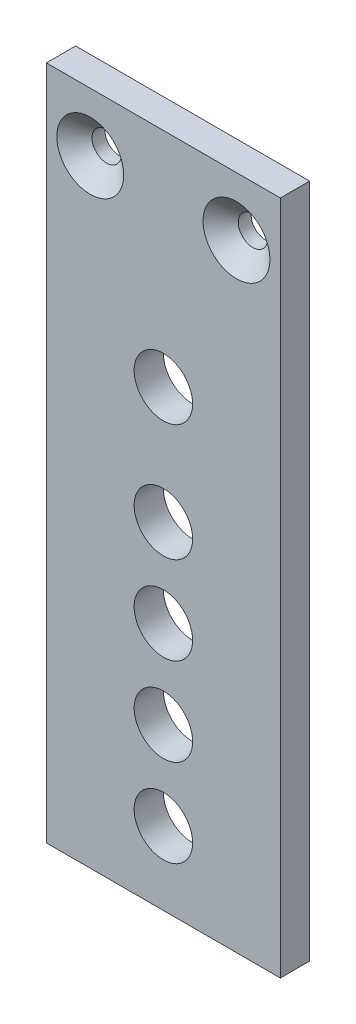
ISO-10303-21;
HEADER;
FILE_DESCRIPTION(('STEP AP214'),'2;1');
FILE_NAME('part.step','',(''),(''),'','','');
FILE_SCHEMA(('AUTOMOTIVE_DESIGN { 1 0 10303 214 1 1 1 1 }'));
ENDSEC;
DATA;
#1=APPLICATION_CONTEXT('core data for automotive mechanical design processes');
#2=APPLICATION_PROTOCOL_DEFINITION('international standard','automotive_design',2000,#1);
#3=PRODUCT_CONTEXT('',#1,'mechanical');
#4=PRODUCT('Part','Part','',(#3));
#5=PRODUCT_RELATED_PRODUCT_CATEGORY('part','',(#4));
#6=PRODUCT_DEFINITION_FORMATION('','',#4);
#7=PRODUCT_DEFINITION_CONTEXT('part definition',#1,'design');
#8=PRODUCT_DEFINITION('design','',#6,#7);
#9=PRODUCT_DEFINITION_SHAPE('','',#8);
#10=(LENGTH_UNIT() NAMED_UNIT(*) SI_UNIT(.MILLI.,.METRE.));
#11=(NAMED_UNIT(*) PLANE_ANGLE_UNIT() SI_UNIT($,.RADIAN.));
#12=(NAMED_UNIT(*) SI_UNIT($,.STERADIAN.) SOLID_ANGLE_UNIT());
#13=UNCERTAINTY_MEASURE_WITH_UNIT(LENGTH_MEASURE(1.E-05),#10,'distance_accuracy_value','');
#14=(GEOMETRIC_REPRESENTATION_CONTEXT(3) GLOBAL_UNCERTAINTY_ASSIGNED_CONTEXT((#13)) GLOBAL_UNIT_ASSIGNED_CONTEXT((#10,
#11,#12)) REPRESENTATION_CONTEXT('',''));
#15=CARTESIAN_POINT('',(0.,0.,0.));
#16=DIRECTION('',(0.,0.,1.));
#17=DIRECTION('',(1.,0.,0.));
#18=AXIS2_PLACEMENT_3D('',#15,#16,#17);
#19=CARTESIAN_POINT('',(0.,0.,6.35));
#20=DIRECTION('',(0.,0.,1.));
#21=DIRECTION('',(1.,0.,0.));
#22=AXIS2_PLACEMENT_3D('',#19,#20,#21);
#23=PLANE('',#22);
#24=CARTESIAN_POINT('',(15.875,-12.7,6.35));
#25=DIRECTION('',(0.,0.,1.));
#26=DIRECTION('',(1.,0.,0.));
#27=AXIS2_PLACEMENT_3D('',#24,#25,#26);
#28=CIRCLE('',#27,7.2644);
#29=CARTESIAN_POINT('',(23.1394,-12.7,6.35));
#30=VERTEX_POINT('',#29);
#31=EDGE_CURVE('E11',#30,#30,#28,.F.);
#32=ORIENTED_EDGE('',*,*,#31,.T.);
#33=EDGE_LOOP('',(#32));
#34=FACE_BOUND('',#33,.T.);
#35=CARTESIAN_POINT('',(-15.875,-12.7,6.35));
#36=DIRECTION('',(0.,0.,1.));
#37=DIRECTION('',(1.,0.,0.));
#38=AXIS2_PLACEMENT_3D('',#35,#36,#37);
#39=CIRCLE('',#38,7.2644);
#40=CARTESIAN_POINT('',(-8.6106,-12.7,6.35));
#41=VERTEX_POINT('',#40);
#42=EDGE_CURVE('E122',#41,#41,#39,.F.);
#43=ORIENTED_EDGE('',*,*,#42,.T.);
#44=EDGE_LOOP('',(#43));
#45=FACE_BOUND('',#44,.T.);
#46=CARTESIAN_POINT('',(0.,-73.66,6.35));
#47=DIRECTION('',(0.,0.,1.));
#48=DIRECTION('',(1.,0.,0.));
#49=AXIS2_PLACEMENT_3D('',#46,#47,#48);
#50=CIRCLE('',#49,6.34999999999999);
#51=CARTESIAN_POINT('',(6.35,-73.66,6.35));
#52=VERTEX_POINT('',#51);
#53=EDGE_CURVE('E203',#52,#52,#50,.T.);
#54=ORIENTED_EDGE('',*,*,#53,.F.);
#55=EDGE_LOOP('',(#54));
#56=FACE_BOUND('',#55,.T.);
#57=CARTESIAN_POINT('',(0.,-111.76,6.35));
#58=DIRECTION('',(0.,0.,1.));
#59=DIRECTION('',(1.,0.,0.));
#60=AXIS2_PLACEMENT_3D('',#57,#58,#59);
#61=CIRCLE('',#60,6.35);
#62=CARTESIAN_POINT('',(6.35000000000001,-111.76,6.35));
#63=VERTEX_POINT('',#62);
#64=EDGE_CURVE('E211',#63,#63,#61,.T.);
#65=ORIENTED_EDGE('',*,*,#64,.F.);
#66=EDGE_LOOP('',(#65));
#67=FACE_BOUND('',#66,.T.);
#68=DIRECTION('',(0.,-1.,0.));
#69=VECTOR('',#68,1.);
#70=CARTESIAN_POINT('',(-25.4,0.,6.35));
#71=LINE('',#70,#69);
#72=CARTESIAN_POINT('',(-25.4,0.,6.35));
#73=VERTEX_POINT('',#72);
#74=CARTESIAN_POINT('',(-25.4,-146.685,6.35));
#75=VERTEX_POINT('',#74);
#76=EDGE_CURVE('E94',#73,#75,#71,.T.);
#77=ORIENTED_EDGE('',*,*,#76,.T.);
#78=DIRECTION('',(1.,0.,0.));
#79=VECTOR('',#78,1.);
#80=CARTESIAN_POINT('',(-25.4,-146.685,6.35));
#81=LINE('',#80,#79);
#82=CARTESIAN_POINT('',(25.4,-146.685,6.35));
#83=VERTEX_POINT('',#82);
#84=EDGE_CURVE('E89',#75,#83,#81,.T.);
#85=ORIENTED_EDGE('',*,*,#84,.T.);
#86=DIRECTION('',(0.,1.,0.));
#87=VECTOR('',#86,1.);
#88=CARTESIAN_POINT('',(25.4,0.,6.35));
#89=LINE('',#88,#87);
#90=CARTESIAN_POINT('',(25.4,0.,6.35));
#91=VERTEX_POINT('',#90);
#92=EDGE_CURVE('E92',#83,#91,#89,.T.);
#93=ORIENTED_EDGE('',*,*,#92,.T.);
#94=DIRECTION('',(-1.,0.,0.));
#95=VECTOR('',#94,1.);
#96=CARTESIAN_POINT('',(-25.4,0.,6.35));
#97=LINE('',#96,#95);
#98=EDGE_CURVE('E58',#91,#73,#97,.T.);
#99=ORIENTED_EDGE('',*,*,#98,.T.);
#100=EDGE_LOOP('',(#77,#85,#93,#99));
#101=FACE_BOUND('',#100,.T.);
#102=CARTESIAN_POINT('',(0.,-130.81,6.35));
#103=DIRECTION('',(0.,0.,1.));
#104=DIRECTION('',(1.,0.,0.));
#105=AXIS2_PLACEMENT_3D('',#102,#103,#104);
#106=CIRCLE('',#105,6.35);
#107=CARTESIAN_POINT('',(6.35000000000001,-130.81,6.35));
#108=VERTEX_POINT('',#107);
#109=EDGE_CURVE('E112',#108,#108,#106,.T.);
#110=ORIENTED_EDGE('',*,*,#109,.F.);
#111=EDGE_LOOP('',(#110));
#112=FACE_BOUND('',#111,.T.);
#113=CARTESIAN_POINT('',(0.,-92.71,6.35));
#114=DIRECTION('',(0.,0.,1.));
#115=DIRECTION('',(1.,0.,0.));
#116=AXIS2_PLACEMENT_3D('',#113,#114,#115);
#117=CIRCLE('',#116,6.35);
#118=CARTESIAN_POINT('',(6.35,-92.71,6.35));
#119=VERTEX_POINT('',#118);
#120=EDGE_CURVE('E207',#119,#119,#117,.T.);
#121=ORIENTED_EDGE('',*,*,#120,.F.);
#122=EDGE_LOOP('',(#121));
#123=FACE_BOUND('',#122,.T.);
#124=CARTESIAN_POINT('',(0.,-48.26,6.35));
#125=DIRECTION('',(0.,0.,1.));
#126=DIRECTION('',(1.,0.,0.));
#127=AXIS2_PLACEMENT_3D('',#124,#125,#126);
#128=CIRCLE('',#127,6.35);
#129=CARTESIAN_POINT('',(6.35000000000001,-48.26,6.35));
#130=VERTEX_POINT('',#129);
#131=EDGE_CURVE('E196',#130,#130,#128,.T.);
#132=ORIENTED_EDGE('',*,*,#131,.F.);
#133=EDGE_LOOP('',(#132));
#134=FACE_BOUND('',#133,.T.);
#135=ADVANCED_FACE('F41',(#34,#45,#56,#67,#101,#112,#123,#134),#23,.T.);
#136=CARTESIAN_POINT('',(0.,0.,0.));
#137=DIRECTION('',(0.,0.,1.));
#138=DIRECTION('',(1.,0.,0.));
#139=AXIS2_PLACEMENT_3D('',#136,#137,#138);
#140=PLANE('',#139);
#141=DIRECTION('',(0.,-1.,0.));
#142=VECTOR('',#141,1.);
#143=CARTESIAN_POINT('',(-25.4,0.,0.));
#144=LINE('',#143,#142);
#145=CARTESIAN_POINT('',(-25.4,0.,0.));
#146=VERTEX_POINT('',#145);
#147=CARTESIAN_POINT('',(-25.4,-146.685,0.));
#148=VERTEX_POINT('',#147);
#149=EDGE_CURVE('E109',#146,#148,#144,.T.);
#150=ORIENTED_EDGE('',*,*,#149,.F.);
#151=DIRECTION('',(-1.,0.,0.));
#152=VECTOR('',#151,1.);
#153=CARTESIAN_POINT('',(-25.4,0.,0.));
#154=LINE('',#153,#152);
#155=CARTESIAN_POINT('',(25.4,0.,0.));
#156=VERTEX_POINT('',#155);
#157=EDGE_CURVE('E81',#156,#146,#154,.T.);
#158=ORIENTED_EDGE('',*,*,#157,.F.);
#159=DIRECTION('',(0.,1.,0.));
#160=VECTOR('',#159,1.);
#161=CARTESIAN_POINT('',(25.4,0.,0.));
#162=LINE('',#161,#160);
#163=CARTESIAN_POINT('',(25.4,-146.685,0.));
#164=VERTEX_POINT('',#163);
#165=EDGE_CURVE('E75',#164,#156,#162,.T.);
#166=ORIENTED_EDGE('',*,*,#165,.F.);
#167=DIRECTION('',(1.,0.,0.));
#168=VECTOR('',#167,1.);
#169=CARTESIAN_POINT('',(-25.4,-146.685,0.));
#170=LINE('',#169,#168);
#171=EDGE_CURVE('E99',#148,#164,#170,.T.);
#172=ORIENTED_EDGE('',*,*,#171,.F.);
#173=EDGE_LOOP('',(#150,#158,#166,#172));
#174=FACE_BOUND('',#173,.T.);
#175=CARTESIAN_POINT('',(0.,-130.81,0.));
#176=DIRECTION('',(0.,0.,1.));
#177=DIRECTION('',(1.,0.,0.));
#178=AXIS2_PLACEMENT_3D('',#175,#176,#177);
#179=CIRCLE('',#178,6.35);
#180=CARTESIAN_POINT('',(6.35000000000001,-130.81,0.));
#181=VERTEX_POINT('',#180);
#182=EDGE_CURVE('E171',#181,#181,#179,.T.);
#183=ORIENTED_EDGE('',*,*,#182,.T.);
#184=EDGE_LOOP('',(#183));
#185=FACE_BOUND('',#184,.T.);
#186=CARTESIAN_POINT('',(0.,-111.76,0.));
#187=DIRECTION('',(0.,0.,1.));
#188=DIRECTION('',(1.,0.,0.));
#189=AXIS2_PLACEMENT_3D('',#186,#187,#188);
#190=CIRCLE('',#189,6.35);
#191=CARTESIAN_POINT('',(6.35000000000001,-111.76,0.));
#192=VERTEX_POINT('',#191);
#193=EDGE_CURVE('E175',#192,#192,#190,.T.);
#194=ORIENTED_EDGE('',*,*,#193,.T.);
#195=EDGE_LOOP('',(#194));
#196=FACE_BOUND('',#195,.T.);
#197=CARTESIAN_POINT('',(0.,-92.71,0.));
#198=DIRECTION('',(0.,0.,1.));
#199=DIRECTION('',(1.,0.,0.));
#200=AXIS2_PLACEMENT_3D('',#197,#198,#199);
#201=CIRCLE('',#200,6.35);
#202=CARTESIAN_POINT('',(6.35,-92.71,0.));
#203=VERTEX_POINT('',#202);
#204=EDGE_CURVE('E179',#203,#203,#201,.T.);
#205=ORIENTED_EDGE('',*,*,#204,.T.);
#206=EDGE_LOOP('',(#205));
#207=FACE_BOUND('',#206,.T.);
#208=CARTESIAN_POINT('',(0.,-73.66,0.));
#209=DIRECTION('',(0.,0.,1.));
#210=DIRECTION('',(1.,0.,0.));
#211=AXIS2_PLACEMENT_3D('',#208,#209,#210);
#212=CIRCLE('',#211,6.34999999999999);
#213=CARTESIAN_POINT('',(6.35,-73.66,0.));
#214=VERTEX_POINT('',#213);
#215=EDGE_CURVE('E183',#214,#214,#212,.T.);
#216=ORIENTED_EDGE('',*,*,#215,.T.);
#217=EDGE_LOOP('',(#216));
#218=FACE_BOUND('',#217,.T.);
#219=CARTESIAN_POINT('',(-15.875,-12.7,0.));
#220=DIRECTION('',(0.,0.,1.));
#221=DIRECTION('',(1.,0.,0.));
#222=AXIS2_PLACEMENT_3D('',#219,#220,#221);
#223=CIRCLE('',#222,3.175);
#224=CARTESIAN_POINT('',(-12.7,-12.7,0.));
#225=VERTEX_POINT('',#224);
#226=EDGE_CURVE('E187',#225,#225,#223,.T.);
#227=ORIENTED_EDGE('',*,*,#226,.T.);
#228=EDGE_LOOP('',(#227));
#229=FACE_BOUND('',#228,.T.);
#230=CARTESIAN_POINT('',(15.875,-12.7,0.));
#231=DIRECTION('',(0.,0.,1.));
#232=DIRECTION('',(1.,0.,0.));
#233=AXIS2_PLACEMENT_3D('',#230,#231,#232);
#234=CIRCLE('',#233,3.175);
#235=CARTESIAN_POINT('',(19.05,-12.7,0.));
#236=VERTEX_POINT('',#235);
#237=EDGE_CURVE('E191',#236,#236,#234,.T.);
#238=ORIENTED_EDGE('',*,*,#237,.T.);
#239=EDGE_LOOP('',(#238));
#240=FACE_BOUND('',#239,.T.);
#241=CARTESIAN_POINT('',(0.,-48.26,0.));
#242=DIRECTION('',(0.,0.,1.));
#243=DIRECTION('',(1.,0.,0.));
#244=AXIS2_PLACEMENT_3D('',#241,#242,#243);
#245=CIRCLE('',#244,6.35);
#246=CARTESIAN_POINT('',(6.35000000000001,-48.26,0.));
#247=VERTEX_POINT('',#246);
#248=EDGE_CURVE('E194',#247,#247,#245,.T.);
#249=ORIENTED_EDGE('',*,*,#248,.T.);
#250=EDGE_LOOP('',(#249));
#251=FACE_BOUND('',#250,.T.);
#252=ADVANCED_FACE('F141',(#174,#185,#196,#207,#218,#229,#240,#251),#140,.F.);
#253=CARTESIAN_POINT('',(-25.4,0.,6.35));
#254=DIRECTION('',(1.,0.,0.));
#255=DIRECTION('',(0.,1.,0.));
#256=AXIS2_PLACEMENT_3D('',#253,#254,#255);
#257=PLANE('',#256);
#258=ORIENTED_EDGE('',*,*,#149,.T.);
#259=DIRECTION('',(0.,0.,-1.));
#260=VECTOR('',#259,1.);
#261=CARTESIAN_POINT('',(-25.4,-146.685,6.35));
#262=LINE('',#261,#260);
#263=EDGE_CURVE('E100',#75,#148,#262,.T.);
#264=ORIENTED_EDGE('',*,*,#263,.F.);
#265=ORIENTED_EDGE('',*,*,#76,.F.);
#266=DIRECTION('',(0.,0.,-1.));
#267=VECTOR('',#266,1.);
#268=CARTESIAN_POINT('',(-25.4,0.,6.35));
#269=LINE('',#268,#267);
#270=EDGE_CURVE('E105',#73,#146,#269,.T.);
#271=ORIENTED_EDGE('',*,*,#270,.T.);
#272=EDGE_LOOP('',(#258,#264,#265,#271));
#273=FACE_BOUND('',#272,.T.);
#274=ADVANCED_FACE('F147',(#273),#257,.F.);
#275=CARTESIAN_POINT('',(-25.4,-146.685,6.35));
#276=DIRECTION('',(0.,1.,0.));
#277=DIRECTION('',(0.,0.,1.));
#278=AXIS2_PLACEMENT_3D('',#275,#276,#277);
#279=PLANE('',#278);
#280=ORIENTED_EDGE('',*,*,#171,.T.);
#281=DIRECTION('',(0.,0.,-1.));
#282=VECTOR('',#281,1.);
#283=CARTESIAN_POINT('',(25.4,-146.685,6.35));
#284=LINE('',#283,#282);
#285=EDGE_CURVE('E97',#83,#164,#284,.T.);
#286=ORIENTED_EDGE('',*,*,#285,.F.);
#287=ORIENTED_EDGE('',*,*,#84,.F.);
#288=ORIENTED_EDGE('',*,*,#263,.T.);
#289=EDGE_LOOP('',(#280,#286,#287,#288));
#290=FACE_BOUND('',#289,.T.);
#291=ADVANCED_FACE('F98',(#290),#279,.F.);
#292=CARTESIAN_POINT('',(25.4,0.,6.35));
#293=DIRECTION('',(-1.,0.,0.));
#294=DIRECTION('',(0.,-1.,0.));
#295=AXIS2_PLACEMENT_3D('',#292,#293,#294);
#296=PLANE('',#295);
#297=ORIENTED_EDGE('',*,*,#165,.T.);
#298=DIRECTION('',(0.,0.,-1.));
#299=VECTOR('',#298,1.);
#300=CARTESIAN_POINT('',(25.4,0.,6.35));
#301=LINE('',#300,#299);
#302=EDGE_CURVE('E101',#91,#156,#301,.T.);
#303=ORIENTED_EDGE('',*,*,#302,.F.);
#304=ORIENTED_EDGE('',*,*,#92,.F.);
#305=ORIENTED_EDGE('',*,*,#285,.T.);
#306=EDGE_LOOP('',(#297,#303,#304,#305));
#307=FACE_BOUND('',#306,.T.);
#308=ADVANCED_FACE('F103',(#307),#296,.F.);
#309=CARTESIAN_POINT('',(-25.4,0.,6.35));
#310=DIRECTION('',(0.,-1.,0.));
#311=DIRECTION('',(0.,0.,-1.));
#312=AXIS2_PLACEMENT_3D('',#309,#310,#311);
#313=PLANE('',#312);
#314=ORIENTED_EDGE('',*,*,#157,.T.);
#315=ORIENTED_EDGE('',*,*,#270,.F.);
#316=ORIENTED_EDGE('',*,*,#98,.F.);
#317=ORIENTED_EDGE('',*,*,#302,.T.);
#318=EDGE_LOOP('',(#314,#315,#316,#317));
#319=FACE_BOUND('',#318,.T.);
#320=ADVANCED_FACE('F155',(#319),#313,.F.);
#321=CARTESIAN_POINT('',(0.,-130.81,6.35));
#322=DIRECTION('',(0.,0.,-1.));
#323=DIRECTION('',(-1.,0.,0.));
#324=AXIS2_PLACEMENT_3D('',#321,#322,#323);
#325=CYLINDRICAL_SURFACE('',#324,6.35);
#326=ORIENTED_EDGE('',*,*,#109,.T.);
#327=EDGE_LOOP('',(#326));
#328=FACE_BOUND('',#327,.T.);
#329=ORIENTED_EDGE('',*,*,#182,.F.);
#330=EDGE_LOOP('',(#329));
#331=FACE_BOUND('',#330,.T.);
#332=ADVANCED_FACE('F152',(#328,#331),#325,.F.);
#333=CARTESIAN_POINT('',(0.,-111.76,6.35));
#334=DIRECTION('',(0.,0.,-1.));
#335=DIRECTION('',(-1.,0.,0.));
#336=AXIS2_PLACEMENT_3D('',#333,#334,#335);
#337=CYLINDRICAL_SURFACE('',#336,6.35);
#338=ORIENTED_EDGE('',*,*,#64,.T.);
#339=EDGE_LOOP('',(#338));
#340=FACE_BOUND('',#339,.T.);
#341=ORIENTED_EDGE('',*,*,#193,.F.);
#342=EDGE_LOOP('',(#341));
#343=FACE_BOUND('',#342,.T.);
#344=ADVANCED_FACE('F241',(#340,#343),#337,.F.);
#345=CARTESIAN_POINT('',(0.,-92.71,6.35));
#346=DIRECTION('',(0.,0.,-1.));
#347=DIRECTION('',(-1.,0.,0.));
#348=AXIS2_PLACEMENT_3D('',#345,#346,#347);
#349=CYLINDRICAL_SURFACE('',#348,6.35);
#350=ORIENTED_EDGE('',*,*,#120,.T.);
#351=EDGE_LOOP('',(#350));
#352=FACE_BOUND('',#351,.T.);
#353=ORIENTED_EDGE('',*,*,#204,.F.);
#354=EDGE_LOOP('',(#353));
#355=FACE_BOUND('',#354,.T.);
#356=ADVANCED_FACE('F238',(#352,#355),#349,.F.);
#357=CARTESIAN_POINT('',(0.,-73.66,6.35));
#358=DIRECTION('',(0.,0.,-1.));
#359=DIRECTION('',(-1.,0.,0.));
#360=AXIS2_PLACEMENT_3D('',#357,#358,#359);
#361=CYLINDRICAL_SURFACE('',#360,6.34999999999999);
#362=ORIENTED_EDGE('',*,*,#53,.T.);
#363=EDGE_LOOP('',(#362));
#364=FACE_BOUND('',#363,.T.);
#365=ORIENTED_EDGE('',*,*,#215,.F.);
#366=EDGE_LOOP('',(#365));
#367=FACE_BOUND('',#366,.T.);
#368=ADVANCED_FACE('F235',(#364,#367),#361,.F.);
#369=CARTESIAN_POINT('',(-15.875,-12.7,6.35));
#370=DIRECTION('',(0.,0.,-1.));
#371=DIRECTION('',(-1.,0.,0.));
#372=AXIS2_PLACEMENT_3D('',#369,#370,#371);
#373=CYLINDRICAL_SURFACE('',#372,3.175);
#374=CARTESIAN_POINT('',(-15.875,-12.7,2.79513881437435));
#375=DIRECTION('',(0.,0.,1.));
#376=DIRECTION('',(1.,0.,0.));
#377=AXIS2_PLACEMENT_3D('',#374,#375,#376);
#378=CIRCLE('',#377,3.175);
#379=CARTESIAN_POINT('',(-12.7,-12.7,2.79513881437435));
#380=VERTEX_POINT('',#379);
#381=EDGE_CURVE('E119',#380,#380,#378,.T.);
#382=ORIENTED_EDGE('',*,*,#381,.T.);
#383=EDGE_LOOP('',(#382));
#384=FACE_BOUND('',#383,.T.);
#385=ORIENTED_EDGE('',*,*,#226,.F.);
#386=EDGE_LOOP('',(#385));
#387=FACE_BOUND('',#386,.T.);
#388=ADVANCED_FACE('F231',(#384,#387),#373,.F.);
#389=CARTESIAN_POINT('',(15.875,-12.7,6.35));
#390=DIRECTION('',(0.,0.,-1.));
#391=DIRECTION('',(-1.,0.,0.));
#392=AXIS2_PLACEMENT_3D('',#389,#390,#391);
#393=CYLINDRICAL_SURFACE('',#392,3.175);
#394=CARTESIAN_POINT('',(15.875,-12.7,2.79513881437435));
#395=DIRECTION('',(0.,0.,1.));
#396=DIRECTION('',(1.,0.,0.));
#397=AXIS2_PLACEMENT_3D('',#394,#395,#396);
#398=CIRCLE('',#397,3.175);
#399=CARTESIAN_POINT('',(19.05,-12.7,2.79513881437435));
#400=VERTEX_POINT('',#399);
#401=EDGE_CURVE('E50',#400,#400,#398,.T.);
#402=ORIENTED_EDGE('',*,*,#401,.T.);
#403=EDGE_LOOP('',(#402));
#404=FACE_BOUND('',#403,.T.);
#405=ORIENTED_EDGE('',*,*,#237,.F.);
#406=EDGE_LOOP('',(#405));
#407=FACE_BOUND('',#406,.T.);
#408=ADVANCED_FACE('F127',(#404,#407),#393,.F.);
#409=CARTESIAN_POINT('',(0.,-48.26,6.35));
#410=DIRECTION('',(0.,0.,-1.));
#411=DIRECTION('',(-1.,0.,0.));
#412=AXIS2_PLACEMENT_3D('',#409,#410,#411);
#413=CYLINDRICAL_SURFACE('',#412,6.35);
#414=ORIENTED_EDGE('',*,*,#131,.T.);
#415=EDGE_LOOP('',(#414));
#416=FACE_BOUND('',#415,.T.);
#417=ORIENTED_EDGE('',*,*,#248,.F.);
#418=EDGE_LOOP('',(#417));
#419=FACE_BOUND('',#418,.T.);
#420=ADVANCED_FACE('F137',(#416,#419),#413,.F.);
#421=CARTESIAN_POINT('',(-15.875,-12.7,2.79513881437435));
#422=DIRECTION('',(0.,0.,1.));
#423=DIRECTION('',(1.,0.,0.));
#424=AXIS2_PLACEMENT_3D('',#421,#422,#423);
#425=CONICAL_SURFACE('',#424,3.175,0.855211333477226);
#426=ORIENTED_EDGE('',*,*,#42,.F.);
#427=EDGE_LOOP('',(#426));
#428=FACE_BOUND('',#427,.T.);
#429=ORIENTED_EDGE('',*,*,#381,.F.);
#430=EDGE_LOOP('',(#429));
#431=FACE_BOUND('',#430,.T.);
#432=ADVANCED_FACE('F131',(#428,#431),#425,.F.);
#433=CARTESIAN_POINT('',(15.875,-12.7,2.79513881437435));
#434=DIRECTION('',(0.,0.,1.));
#435=DIRECTION('',(1.,0.,0.));
#436=AXIS2_PLACEMENT_3D('',#433,#434,#435);
#437=CONICAL_SURFACE('',#436,3.175,0.855211333477226);
#438=ORIENTED_EDGE('',*,*,#31,.F.);
#439=EDGE_LOOP('',(#438));
#440=FACE_BOUND('',#439,.T.);
#441=ORIENTED_EDGE('',*,*,#401,.F.);
#442=EDGE_LOOP('',(#441));
#443=FACE_BOUND('',#442,.T.);
#444=ADVANCED_FACE('F43',(#440,#443),#437,.F.);
#445=CLOSED_SHELL('',(#135,#252,#274,#291,#308,#320,#332,#344,#356,#368,#388,#408,#420,#432,#444));
#446=MANIFOLD_SOLID_BREP('B2',#445);
#447=ADVANCED_BREP_SHAPE_REPRESENTATION('',(#18,#446),#14);
#448=SHAPE_DEFINITION_REPRESENTATION(#9,#447);
ENDSEC;
END-ISO-10303-21;
